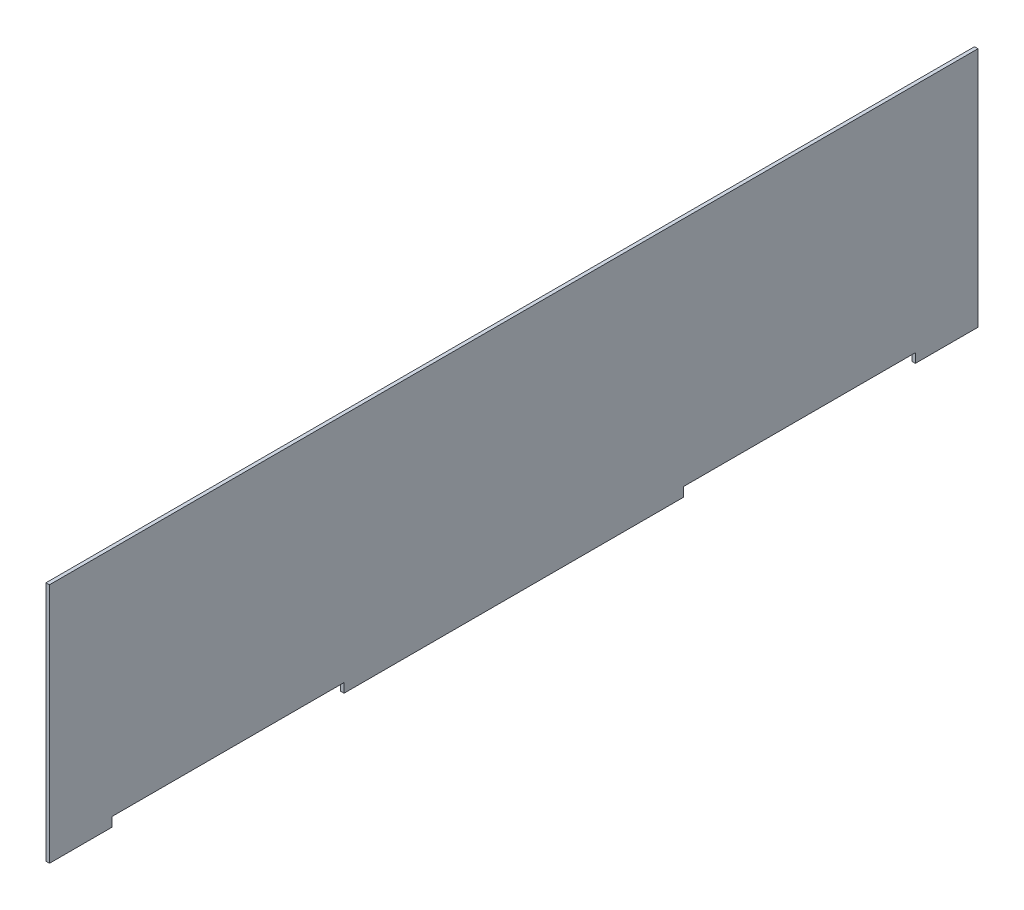
ISO-10303-21;
HEADER;
FILE_DESCRIPTION(('STEP AP214'),'2;1');
FILE_NAME('part.step','',(''),(''),'','','');
FILE_SCHEMA(('AUTOMOTIVE_DESIGN { 1 0 10303 214 1 1 1 1 }'));
ENDSEC;
DATA;
#1=APPLICATION_CONTEXT('core data for automotive mechanical design processes');
#2=APPLICATION_PROTOCOL_DEFINITION('international standard','automotive_design',2000,#1);
#3=PRODUCT_CONTEXT('',#1,'mechanical');
#4=PRODUCT('Part','Part','',(#3));
#5=PRODUCT_RELATED_PRODUCT_CATEGORY('part','',(#4));
#6=PRODUCT_DEFINITION_FORMATION('','',#4);
#7=PRODUCT_DEFINITION_CONTEXT('part definition',#1,'design');
#8=PRODUCT_DEFINITION('design','',#6,#7);
#9=PRODUCT_DEFINITION_SHAPE('','',#8);
#10=(LENGTH_UNIT() NAMED_UNIT(*) SI_UNIT(.MILLI.,.METRE.));
#11=(NAMED_UNIT(*) PLANE_ANGLE_UNIT() SI_UNIT($,.RADIAN.));
#12=(NAMED_UNIT(*) SI_UNIT($,.STERADIAN.) SOLID_ANGLE_UNIT());
#13=UNCERTAINTY_MEASURE_WITH_UNIT(LENGTH_MEASURE(1.E-05),#10,'distance_accuracy_value','');
#14=(GEOMETRIC_REPRESENTATION_CONTEXT(3) GLOBAL_UNCERTAINTY_ASSIGNED_CONTEXT((#13)) GLOBAL_UNIT_ASSIGNED_CONTEXT((#10,
#11,#12)) REPRESENTATION_CONTEXT('',''));
#15=CARTESIAN_POINT('',(0.,0.,0.));
#16=DIRECTION('',(0.,0.,1.));
#17=DIRECTION('',(1.,0.,0.));
#18=AXIS2_PLACEMENT_3D('',#15,#16,#17);
#19=CARTESIAN_POINT('',(30.,-1216.94347785197,-2474.01467130631));
#20=DIRECTION('',(0.,0.,-1.));
#21=DIRECTION('',(-1.,0.,0.));
#22=AXIS2_PLACEMENT_3D('',#19,#20,#21);
#23=PLANE('',#22);
#24=DIRECTION('',(0.,-1.,0.));
#25=VECTOR('',#24,1.);
#26=CARTESIAN_POINT('',(0.,-1216.94347785197,-2474.01467130631));
#27=LINE('',#26,#25);
#28=CARTESIAN_POINT('',(0.,-1216.94347785197,-2474.01467130631));
#29=VERTEX_POINT('',#28);
#30=CARTESIAN_POINT('',(0.,-1296.94347785197,-2474.01467130631));
#31=VERTEX_POINT('',#30);
#32=EDGE_CURVE('E164',#29,#31,#27,.T.);
#33=ORIENTED_EDGE('',*,*,#32,.T.);
#34=DIRECTION('',(-1.,0.,0.));
#35=VECTOR('',#34,1.);
#36=CARTESIAN_POINT('',(30.,-1296.94347785197,-2474.01467130631));
#37=LINE('',#36,#35);
#38=CARTESIAN_POINT('',(30.,-1296.94347785197,-2474.01467130631));
#39=VERTEX_POINT('',#38);
#40=EDGE_CURVE('E11',#39,#31,#37,.T.);
#41=ORIENTED_EDGE('',*,*,#40,.F.);
#42=DIRECTION('',(0.,-1.,0.));
#43=VECTOR('',#42,1.);
#44=CARTESIAN_POINT('',(30.,-1216.94347785197,-2474.01467130631));
#45=LINE('',#44,#43);
#46=CARTESIAN_POINT('',(30.,-1216.94347785197,-2474.01467130631));
#47=VERTEX_POINT('',#46);
#48=EDGE_CURVE('E198',#47,#39,#45,.T.);
#49=ORIENTED_EDGE('',*,*,#48,.F.);
#50=DIRECTION('',(-1.,0.,0.));
#51=VECTOR('',#50,1.);
#52=CARTESIAN_POINT('',(30.,-1216.94347785197,-2474.01467130631));
#53=LINE('',#52,#51);
#54=EDGE_CURVE('E160',#47,#29,#53,.T.);
#55=ORIENTED_EDGE('',*,*,#54,.T.);
#56=EDGE_LOOP('',(#33,#41,#49,#55));
#57=FACE_BOUND('',#56,.T.);
#58=ADVANCED_FACE('F39',(#57),#23,.F.);
#59=CARTESIAN_POINT('',(30.,-1296.94347785197,-2474.01467130631));
#60=DIRECTION('',(0.,1.,0.));
#61=DIRECTION('',(0.,0.,1.));
#62=AXIS2_PLACEMENT_3D('',#59,#60,#61);
#63=PLANE('',#62);
#64=DIRECTION('',(0.,0.,-1.));
#65=VECTOR('',#64,1.);
#66=CARTESIAN_POINT('',(0.,-1296.94347785197,-2474.01467130631));
#67=LINE('',#66,#65);
#68=CARTESIAN_POINT('',(0.,-1296.94347785197,-3014.01467130631));
#69=VERTEX_POINT('',#68);
#70=EDGE_CURVE('E168',#31,#69,#67,.T.);
#71=ORIENTED_EDGE('',*,*,#70,.T.);
#72=DIRECTION('',(-1.,0.,0.));
#73=VECTOR('',#72,1.);
#74=CARTESIAN_POINT('',(30.,-1296.94347785197,-3014.01467130631));
#75=LINE('',#74,#73);
#76=CARTESIAN_POINT('',(30.,-1296.94347785197,-3014.01467130631));
#77=VERTEX_POINT('',#76);
#78=EDGE_CURVE('E48',#77,#69,#75,.T.);
#79=ORIENTED_EDGE('',*,*,#78,.F.);
#80=DIRECTION('',(0.,0.,-1.));
#81=VECTOR('',#80,1.);
#82=CARTESIAN_POINT('',(30.,-1296.94347785197,-2474.01467130631));
#83=LINE('',#82,#81);
#84=EDGE_CURVE('E111',#39,#77,#83,.T.);
#85=ORIENTED_EDGE('',*,*,#84,.F.);
#86=ORIENTED_EDGE('',*,*,#40,.T.);
#87=EDGE_LOOP('',(#71,#79,#85,#86));
#88=FACE_BOUND('',#87,.T.);
#89=ADVANCED_FACE('F292',(#88),#63,.F.);
#90=CARTESIAN_POINT('',(30.,-1296.94347785197,-3014.01467130631));
#91=DIRECTION('',(0.,0.,1.));
#92=DIRECTION('',(1.,0.,0.));
#93=AXIS2_PLACEMENT_3D('',#90,#91,#92);
#94=PLANE('',#93);
#95=DIRECTION('',(0.,1.,0.));
#96=VECTOR('',#95,1.);
#97=CARTESIAN_POINT('',(0.,-1296.94347785197,-3014.01467130631));
#98=LINE('',#97,#96);
#99=CARTESIAN_POINT('',(0.,783.05652214803,-3014.01467130631));
#100=VERTEX_POINT('',#99);
#101=EDGE_CURVE('E171',#69,#100,#98,.T.);
#102=ORIENTED_EDGE('',*,*,#101,.T.);
#103=DIRECTION('',(-1.,0.,0.));
#104=VECTOR('',#103,1.);
#105=CARTESIAN_POINT('',(30.,783.05652214803,-3014.01467130631));
#106=LINE('',#105,#104);
#107=CARTESIAN_POINT('',(30.,783.05652214803,-3014.01467130631));
#108=VERTEX_POINT('',#107);
#109=EDGE_CURVE('E225',#108,#100,#106,.T.);
#110=ORIENTED_EDGE('',*,*,#109,.F.);
#111=DIRECTION('',(0.,1.,0.));
#112=VECTOR('',#111,1.);
#113=CARTESIAN_POINT('',(30.,-1296.94347785197,-3014.01467130631));
#114=LINE('',#113,#112);
#115=EDGE_CURVE('E235',#77,#108,#114,.T.);
#116=ORIENTED_EDGE('',*,*,#115,.F.);
#117=ORIENTED_EDGE('',*,*,#78,.T.);
#118=EDGE_LOOP('',(#102,#110,#116,#117));
#119=FACE_BOUND('',#118,.T.);
#120=ADVANCED_FACE('F233',(#119),#94,.F.);
#121=CARTESIAN_POINT('',(30.,783.05652214803,4991.98532869369));
#122=DIRECTION('',(0.,-1.,0.));
#123=DIRECTION('',(0.,0.,-1.));
#124=AXIS2_PLACEMENT_3D('',#121,#122,#123);
#125=PLANE('',#124);
#126=DIRECTION('',(0.,0.,1.));
#127=VECTOR('',#126,1.);
#128=CARTESIAN_POINT('',(0.,783.05652214803,4991.98532869369));
#129=LINE('',#128,#127);
#130=CARTESIAN_POINT('',(0.,783.05652214803,4991.98532869369));
#131=VERTEX_POINT('',#130);
#132=EDGE_CURVE('E174',#100,#131,#129,.T.);
#133=ORIENTED_EDGE('',*,*,#132,.T.);
#134=DIRECTION('',(-1.,0.,0.));
#135=VECTOR('',#134,1.);
#136=CARTESIAN_POINT('',(30.,783.05652214803,4991.98532869369));
#137=LINE('',#136,#135);
#138=CARTESIAN_POINT('',(30.,783.05652214803,4991.98532869369));
#139=VERTEX_POINT('',#138);
#140=EDGE_CURVE('E221',#139,#131,#137,.T.);
#141=ORIENTED_EDGE('',*,*,#140,.F.);
#142=DIRECTION('',(0.,0.,1.));
#143=VECTOR('',#142,1.);
#144=CARTESIAN_POINT('',(30.,783.05652214803,4991.98532869369));
#145=LINE('',#144,#143);
#146=EDGE_CURVE('E254',#108,#139,#145,.T.);
#147=ORIENTED_EDGE('',*,*,#146,.F.);
#148=ORIENTED_EDGE('',*,*,#109,.T.);
#149=EDGE_LOOP('',(#133,#141,#147,#148));
#150=FACE_BOUND('',#149,.T.);
#151=ADVANCED_FACE('F244',(#150),#125,.F.);
#152=CARTESIAN_POINT('',(30.,783.05652214803,4991.98532869369));
#153=DIRECTION('',(0.,0.,-1.));
#154=DIRECTION('',(0.,1.,0.));
#155=AXIS2_PLACEMENT_3D('',#152,#153,#154);
#156=PLANE('',#155);
#157=DIRECTION('',(0.,-1.,0.));
#158=VECTOR('',#157,1.);
#159=CARTESIAN_POINT('',(0.,783.05652214803,4991.98532869369));
#160=LINE('',#159,#158);
#161=CARTESIAN_POINT('',(0.,-1296.94347785197,4991.98532869369));
#162=VERTEX_POINT('',#161);
#163=EDGE_CURVE('E177',#131,#162,#160,.T.);
#164=ORIENTED_EDGE('',*,*,#163,.T.);
#165=DIRECTION('',(-1.,0.,0.));
#166=VECTOR('',#165,1.);
#167=CARTESIAN_POINT('',(30.,-1296.94347785197,4991.98532869369));
#168=LINE('',#167,#166);
#169=CARTESIAN_POINT('',(30.,-1296.94347785197,4991.98532869369));
#170=VERTEX_POINT('',#169);
#171=EDGE_CURVE('E217',#170,#162,#168,.T.);
#172=ORIENTED_EDGE('',*,*,#171,.F.);
#173=DIRECTION('',(0.,-1.,0.));
#174=VECTOR('',#173,1.);
#175=CARTESIAN_POINT('',(30.,783.05652214803,4991.98532869369));
#176=LINE('',#175,#174);
#177=EDGE_CURVE('E250',#139,#170,#176,.T.);
#178=ORIENTED_EDGE('',*,*,#177,.F.);
#179=ORIENTED_EDGE('',*,*,#140,.T.);
#180=EDGE_LOOP('',(#164,#172,#178,#179));
#181=FACE_BOUND('',#180,.T.);
#182=ADVANCED_FACE('F248',(#181),#156,.F.);
#183=CARTESIAN_POINT('',(30.,-1296.94347785197,4991.98532869369));
#184=DIRECTION('',(0.,1.,0.));
#185=DIRECTION('',(0.,0.,1.));
#186=AXIS2_PLACEMENT_3D('',#183,#184,#185);
#187=PLANE('',#186);
#188=DIRECTION('',(0.,0.,-1.));
#189=VECTOR('',#188,1.);
#190=CARTESIAN_POINT('',(0.,-1296.94347785197,4991.98532869369));
#191=LINE('',#190,#189);
#192=CARTESIAN_POINT('',(0.,-1296.94347785197,4451.98532869369));
#193=VERTEX_POINT('',#192);
#194=EDGE_CURVE('E180',#162,#193,#191,.T.);
#195=ORIENTED_EDGE('',*,*,#194,.T.);
#196=DIRECTION('',(-1.,0.,0.));
#197=VECTOR('',#196,1.);
#198=CARTESIAN_POINT('',(30.,-1296.94347785197,4451.98532869369));
#199=LINE('',#198,#197);
#200=CARTESIAN_POINT('',(30.,-1296.94347785197,4451.98532869369));
#201=VERTEX_POINT('',#200);
#202=EDGE_CURVE('E213',#201,#193,#199,.T.);
#203=ORIENTED_EDGE('',*,*,#202,.F.);
#204=DIRECTION('',(0.,0.,-1.));
#205=VECTOR('',#204,1.);
#206=CARTESIAN_POINT('',(30.,-1296.94347785197,4991.98532869369));
#207=LINE('',#206,#205);
#208=EDGE_CURVE('E253',#170,#201,#207,.T.);
#209=ORIENTED_EDGE('',*,*,#208,.F.);
#210=ORIENTED_EDGE('',*,*,#171,.T.);
#211=EDGE_LOOP('',(#195,#203,#209,#210));
#212=FACE_BOUND('',#211,.T.);
#213=ADVANCED_FACE('F305',(#212),#187,.F.);
#214=CARTESIAN_POINT('',(30.,-1296.94347785197,4451.98532869369));
#215=DIRECTION('',(0.,0.,1.));
#216=DIRECTION('',(1.,0.,0.));
#217=AXIS2_PLACEMENT_3D('',#214,#215,#216);
#218=PLANE('',#217);
#219=DIRECTION('',(0.,1.,0.));
#220=VECTOR('',#219,1.);
#221=CARTESIAN_POINT('',(0.,-1296.94347785197,4451.98532869369));
#222=LINE('',#221,#220);
#223=CARTESIAN_POINT('',(0.,-1216.94347785197,4451.98532869369));
#224=VERTEX_POINT('',#223);
#225=EDGE_CURVE('E183',#193,#224,#222,.T.);
#226=ORIENTED_EDGE('',*,*,#225,.T.);
#227=DIRECTION('',(-1.,0.,0.));
#228=VECTOR('',#227,1.);
#229=CARTESIAN_POINT('',(30.,-1216.94347785197,4451.98532869369));
#230=LINE('',#229,#228);
#231=CARTESIAN_POINT('',(30.,-1216.94347785197,4451.98532869369));
#232=VERTEX_POINT('',#231);
#233=EDGE_CURVE('E209',#232,#224,#230,.T.);
#234=ORIENTED_EDGE('',*,*,#233,.F.);
#235=DIRECTION('',(0.,1.,0.));
#236=VECTOR('',#235,1.);
#237=CARTESIAN_POINT('',(30.,-1296.94347785197,4451.98532869369));
#238=LINE('',#237,#236);
#239=EDGE_CURVE('E258',#201,#232,#238,.T.);
#240=ORIENTED_EDGE('',*,*,#239,.F.);
#241=ORIENTED_EDGE('',*,*,#202,.T.);
#242=EDGE_LOOP('',(#226,#234,#240,#241));
#243=FACE_BOUND('',#242,.T.);
#244=ADVANCED_FACE('F308',(#243),#218,.F.);
#245=CARTESIAN_POINT('',(30.,-1216.94347785197,4451.98532869369));
#246=DIRECTION('',(0.,1.,0.));
#247=DIRECTION('',(0.,0.,1.));
#248=AXIS2_PLACEMENT_3D('',#245,#246,#247);
#249=PLANE('',#248);
#250=DIRECTION('',(0.,0.,-1.));
#251=VECTOR('',#250,1.);
#252=CARTESIAN_POINT('',(0.,-1216.94347785197,4451.98532869369));
#253=LINE('',#252,#251);
#254=CARTESIAN_POINT('',(0.,-1216.94347785197,2451.98532869369));
#255=VERTEX_POINT('',#254);
#256=EDGE_CURVE('E186',#224,#255,#253,.T.);
#257=ORIENTED_EDGE('',*,*,#256,.T.);
#258=DIRECTION('',(-1.,0.,0.));
#259=VECTOR('',#258,1.);
#260=CARTESIAN_POINT('',(30.,-1216.94347785197,2451.98532869369));
#261=LINE('',#260,#259);
#262=CARTESIAN_POINT('',(30.,-1216.94347785197,2451.98532869369));
#263=VERTEX_POINT('',#262);
#264=EDGE_CURVE('E205',#263,#255,#261,.T.);
#265=ORIENTED_EDGE('',*,*,#264,.F.);
#266=DIRECTION('',(0.,0.,-1.));
#267=VECTOR('',#266,1.);
#268=CARTESIAN_POINT('',(30.,-1216.94347785197,4451.98532869369));
#269=LINE('',#268,#267);
#270=EDGE_CURVE('E265',#232,#263,#269,.T.);
#271=ORIENTED_EDGE('',*,*,#270,.F.);
#272=ORIENTED_EDGE('',*,*,#233,.T.);
#273=EDGE_LOOP('',(#257,#265,#271,#272));
#274=FACE_BOUND('',#273,.T.);
#275=ADVANCED_FACE('F273',(#274),#249,.F.);
#276=CARTESIAN_POINT('',(30.,-1216.94347785197,2451.98532869369));
#277=DIRECTION('',(0.,0.,-1.));
#278=DIRECTION('',(-1.,0.,0.));
#279=AXIS2_PLACEMENT_3D('',#276,#277,#278);
#280=PLANE('',#279);
#281=DIRECTION('',(0.,-1.,0.));
#282=VECTOR('',#281,1.);
#283=CARTESIAN_POINT('',(0.,-1216.94347785197,2451.98532869369));
#284=LINE('',#283,#282);
#285=CARTESIAN_POINT('',(0.,-1296.94347785197,2451.98532869369));
#286=VERTEX_POINT('',#285);
#287=EDGE_CURVE('E189',#255,#286,#284,.T.);
#288=ORIENTED_EDGE('',*,*,#287,.T.);
#289=DIRECTION('',(-1.,0.,0.));
#290=VECTOR('',#289,1.);
#291=CARTESIAN_POINT('',(30.,-1296.94347785197,2451.98532869369));
#292=LINE('',#291,#290);
#293=CARTESIAN_POINT('',(30.,-1296.94347785197,2451.98532869369));
#294=VERTEX_POINT('',#293);
#295=EDGE_CURVE('E153',#294,#286,#292,.T.);
#296=ORIENTED_EDGE('',*,*,#295,.F.);
#297=DIRECTION('',(0.,-1.,0.));
#298=VECTOR('',#297,1.);
#299=CARTESIAN_POINT('',(30.,-1216.94347785197,2451.98532869369));
#300=LINE('',#299,#298);
#301=EDGE_CURVE('E142',#263,#294,#300,.T.);
#302=ORIENTED_EDGE('',*,*,#301,.F.);
#303=ORIENTED_EDGE('',*,*,#264,.T.);
#304=EDGE_LOOP('',(#288,#296,#302,#303));
#305=FACE_BOUND('',#304,.T.);
#306=ADVANCED_FACE('F277',(#305),#280,.F.);
#307=CARTESIAN_POINT('',(30.,-1296.94347785197,2451.98532869369));
#308=DIRECTION('',(0.,1.,0.));
#309=DIRECTION('',(0.,0.,1.));
#310=AXIS2_PLACEMENT_3D('',#307,#308,#309);
#311=PLANE('',#310);
#312=DIRECTION('',(0.,0.,-1.));
#313=VECTOR('',#312,1.);
#314=CARTESIAN_POINT('',(0.,-1296.94347785197,2451.98532869369));
#315=LINE('',#314,#313);
#316=CARTESIAN_POINT('',(0.,-1296.94347785197,-474.014671306311));
#317=VERTEX_POINT('',#316);
#318=EDGE_CURVE('E151',#286,#317,#315,.T.);
#319=ORIENTED_EDGE('',*,*,#318,.T.);
#320=DIRECTION('',(-1.,0.,0.));
#321=VECTOR('',#320,1.);
#322=CARTESIAN_POINT('',(30.,-1296.94347785197,-474.014671306311));
#323=LINE('',#322,#321);
#324=CARTESIAN_POINT('',(30.,-1296.94347785197,-474.014671306311));
#325=VERTEX_POINT('',#324);
#326=EDGE_CURVE('E148',#325,#317,#323,.T.);
#327=ORIENTED_EDGE('',*,*,#326,.F.);
#328=DIRECTION('',(0.,0.,-1.));
#329=VECTOR('',#328,1.);
#330=CARTESIAN_POINT('',(30.,-1296.94347785197,2451.98532869369));
#331=LINE('',#330,#329);
#332=EDGE_CURVE('E136',#294,#325,#331,.T.);
#333=ORIENTED_EDGE('',*,*,#332,.F.);
#334=ORIENTED_EDGE('',*,*,#295,.T.);
#335=EDGE_LOOP('',(#319,#327,#333,#334));
#336=FACE_BOUND('',#335,.T.);
#337=ADVANCED_FACE('F149',(#336),#311,.F.);
#338=CARTESIAN_POINT('',(30.,-1296.94347785197,-474.014671306311));
#339=DIRECTION('',(0.,0.,1.));
#340=DIRECTION('',(1.,0.,0.));
#341=AXIS2_PLACEMENT_3D('',#338,#339,#340);
#342=PLANE('',#341);
#343=DIRECTION('',(0.,1.,0.));
#344=VECTOR('',#343,1.);
#345=CARTESIAN_POINT('',(0.,-1296.94347785197,-474.014671306311));
#346=LINE('',#345,#344);
#347=CARTESIAN_POINT('',(0.,-1216.94347785197,-474.014671306311));
#348=VERTEX_POINT('',#347);
#349=EDGE_CURVE('E97',#317,#348,#346,.T.);
#350=ORIENTED_EDGE('',*,*,#349,.T.);
#351=DIRECTION('',(-1.,0.,0.));
#352=VECTOR('',#351,1.);
#353=CARTESIAN_POINT('',(30.,-1216.94347785197,-474.014671306311));
#354=LINE('',#353,#352);
#355=CARTESIAN_POINT('',(30.,-1216.94347785197,-474.014671306311));
#356=VERTEX_POINT('',#355);
#357=EDGE_CURVE('E154',#356,#348,#354,.T.);
#358=ORIENTED_EDGE('',*,*,#357,.F.);
#359=DIRECTION('',(0.,1.,0.));
#360=VECTOR('',#359,1.);
#361=CARTESIAN_POINT('',(30.,-1296.94347785197,-474.014671306311));
#362=LINE('',#361,#360);
#363=EDGE_CURVE('E140',#325,#356,#362,.T.);
#364=ORIENTED_EDGE('',*,*,#363,.F.);
#365=ORIENTED_EDGE('',*,*,#326,.T.);
#366=EDGE_LOOP('',(#350,#358,#364,#365));
#367=FACE_BOUND('',#366,.T.);
#368=ADVANCED_FACE('F156',(#367),#342,.F.);
#369=CARTESIAN_POINT('',(30.,-1216.94347785197,-474.014671306311));
#370=DIRECTION('',(0.,1.,0.));
#371=DIRECTION('',(0.,0.,1.));
#372=AXIS2_PLACEMENT_3D('',#369,#370,#371);
#373=PLANE('',#372);
#374=DIRECTION('',(0.,0.,-1.));
#375=VECTOR('',#374,1.);
#376=CARTESIAN_POINT('',(0.,-1216.94347785197,-474.014671306311));
#377=LINE('',#376,#375);
#378=EDGE_CURVE('E103',#348,#29,#377,.T.);
#379=ORIENTED_EDGE('',*,*,#378,.T.);
#380=ORIENTED_EDGE('',*,*,#54,.F.);
#381=DIRECTION('',(0.,0.,-1.));
#382=VECTOR('',#381,1.);
#383=CARTESIAN_POINT('',(30.,-1216.94347785197,-474.014671306311));
#384=LINE('',#383,#382);
#385=EDGE_CURVE('E56',#356,#47,#384,.T.);
#386=ORIENTED_EDGE('',*,*,#385,.F.);
#387=ORIENTED_EDGE('',*,*,#357,.T.);
#388=EDGE_LOOP('',(#379,#380,#386,#387));
#389=FACE_BOUND('',#388,.T.);
#390=ADVANCED_FACE('F281',(#389),#373,.F.);
#391=CARTESIAN_POINT('',(30.,0.,0.));
#392=DIRECTION('',(1.,0.,0.));
#393=DIRECTION('',(0.,0.,-1.));
#394=AXIS2_PLACEMENT_3D('',#391,#392,#393);
#395=PLANE('',#394);
#396=ORIENTED_EDGE('',*,*,#48,.T.);
#397=ORIENTED_EDGE('',*,*,#84,.T.);
#398=ORIENTED_EDGE('',*,*,#115,.T.);
#399=ORIENTED_EDGE('',*,*,#146,.T.);
#400=ORIENTED_EDGE('',*,*,#177,.T.);
#401=ORIENTED_EDGE('',*,*,#208,.T.);
#402=ORIENTED_EDGE('',*,*,#239,.T.);
#403=ORIENTED_EDGE('',*,*,#270,.T.);
#404=ORIENTED_EDGE('',*,*,#301,.T.);
#405=ORIENTED_EDGE('',*,*,#332,.T.);
#406=ORIENTED_EDGE('',*,*,#363,.T.);
#407=ORIENTED_EDGE('',*,*,#385,.T.);
#408=EDGE_LOOP('',(#396,#397,#398,#399,#400,#401,#402,#403,#404,#405,#406,#407));
#409=FACE_BOUND('',#408,.T.);
#410=ADVANCED_FACE('F138',(#409),#395,.T.);
#411=CARTESIAN_POINT('',(0.,0.,0.));
#412=DIRECTION('',(1.,0.,0.));
#413=DIRECTION('',(0.,0.,-1.));
#414=AXIS2_PLACEMENT_3D('',#411,#412,#413);
#415=PLANE('',#414);
#416=ORIENTED_EDGE('',*,*,#32,.F.);
#417=ORIENTED_EDGE('',*,*,#378,.F.);
#418=ORIENTED_EDGE('',*,*,#349,.F.);
#419=ORIENTED_EDGE('',*,*,#318,.F.);
#420=ORIENTED_EDGE('',*,*,#287,.F.);
#421=ORIENTED_EDGE('',*,*,#256,.F.);
#422=ORIENTED_EDGE('',*,*,#225,.F.);
#423=ORIENTED_EDGE('',*,*,#194,.F.);
#424=ORIENTED_EDGE('',*,*,#163,.F.);
#425=ORIENTED_EDGE('',*,*,#132,.F.);
#426=ORIENTED_EDGE('',*,*,#101,.F.);
#427=ORIENTED_EDGE('',*,*,#70,.F.);
#428=EDGE_LOOP('',(#416,#417,#418,#419,#420,#421,#422,#423,#424,#425,#426,#427));
#429=FACE_BOUND('',#428,.T.);
#430=ADVANCED_FACE('F239',(#429),#415,.F.);
#431=CLOSED_SHELL('',(#58,#89,#120,#151,#182,#213,#244,#275,#306,#337,#368,#390,#410,#430));
#432=MANIFOLD_SOLID_BREP('B2',#431);
#433=ADVANCED_BREP_SHAPE_REPRESENTATION('',(#18,#432),#14);
#434=SHAPE_DEFINITION_REPRESENTATION(#9,#433);
ENDSEC;
END-ISO-10303-21;
